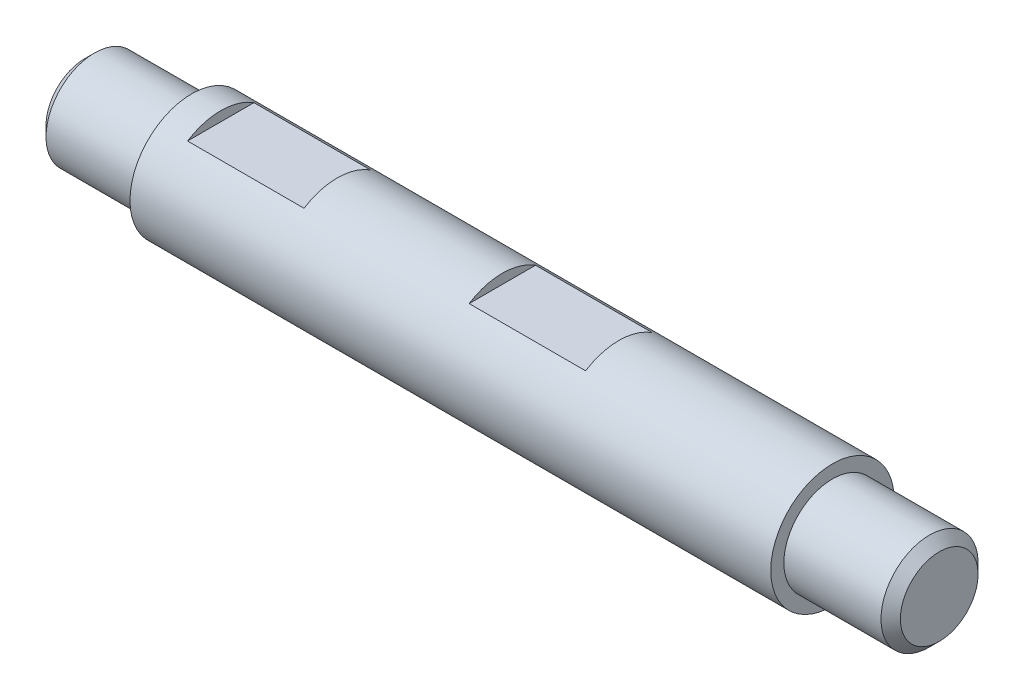
ISO-10303-21;
HEADER;
FILE_DESCRIPTION(('STEP AP214'),'2;1');
FILE_NAME('part.step','',(''),(''),'','','');
FILE_SCHEMA(('AUTOMOTIVE_DESIGN { 1 0 10303 214 1 1 1 1 }'));
ENDSEC;
DATA;
#1=APPLICATION_CONTEXT('core data for automotive mechanical design processes');
#2=APPLICATION_PROTOCOL_DEFINITION('international standard','automotive_design',2000,#1);
#3=PRODUCT_CONTEXT('',#1,'mechanical');
#4=PRODUCT('Part','Part','',(#3));
#5=PRODUCT_RELATED_PRODUCT_CATEGORY('part','',(#4));
#6=PRODUCT_DEFINITION_FORMATION('','',#4);
#7=PRODUCT_DEFINITION_CONTEXT('part definition',#1,'design');
#8=PRODUCT_DEFINITION('design','',#6,#7);
#9=PRODUCT_DEFINITION_SHAPE('','',#8);
#10=(LENGTH_UNIT() NAMED_UNIT(*) SI_UNIT(.MILLI.,.METRE.));
#11=(NAMED_UNIT(*) PLANE_ANGLE_UNIT() SI_UNIT($,.RADIAN.));
#12=(NAMED_UNIT(*) SI_UNIT($,.STERADIAN.) SOLID_ANGLE_UNIT());
#13=UNCERTAINTY_MEASURE_WITH_UNIT(LENGTH_MEASURE(1.E-05),#10,'distance_accuracy_value','');
#14=(GEOMETRIC_REPRESENTATION_CONTEXT(3) GLOBAL_UNCERTAINTY_ASSIGNED_CONTEXT((#13)) GLOBAL_UNIT_ASSIGNED_CONTEXT((#10,
#11,#12)) REPRESENTATION_CONTEXT('',''));
#15=CARTESIAN_POINT('',(0.,0.,0.));
#16=DIRECTION('',(0.,0.,1.));
#17=DIRECTION('',(1.,0.,0.));
#18=AXIS2_PLACEMENT_3D('',#15,#16,#17);
#19=CARTESIAN_POINT('',(-44.,1.20216336885193E-12,0.));
#20=DIRECTION('',(-1.,0.,0.));
#21=DIRECTION('',(0.,0.,1.));
#22=AXIS2_PLACEMENT_3D('',#19,#20,#21);
#23=CYLINDRICAL_SURFACE('',#22,6.3499999999988);
#24=CARTESIAN_POINT('',(-33.,1.20216336885193E-12,0.));
#25=DIRECTION('',(-1.,0.,0.));
#26=DIRECTION('',(0.,0.,1.));
#27=AXIS2_PLACEMENT_3D('',#24,#25,#26);
#28=CIRCLE('',#27,6.3499999999988);
#29=CARTESIAN_POINT('',(-33.,1.20216336885193E-12,6.3499999999988));
#30=VERTEX_POINT('',#29);
#31=EDGE_CURVE('E196',#30,#30,#28,.T.);
#32=ORIENTED_EDGE('',*,*,#31,.F.);
#33=EDGE_LOOP('',(#32));
#34=FACE_BOUND('',#33,.T.);
#35=CARTESIAN_POINT('',(33.,1.20216336885193E-12,0.));
#36=DIRECTION('',(-1.,0.,0.));
#37=DIRECTION('',(0.,0.,1.));
#38=AXIS2_PLACEMENT_3D('',#35,#36,#37);
#39=CIRCLE('',#38,6.3499999999988);
#40=CARTESIAN_POINT('',(33.,1.20216336885193E-12,6.3499999999988));
#41=VERTEX_POINT('',#40);
#42=EDGE_CURVE('E200',#41,#41,#39,.T.);
#43=ORIENTED_EDGE('',*,*,#42,.T.);
#44=EDGE_LOOP('',(#43));
#45=FACE_BOUND('',#44,.T.);
#46=CARTESIAN_POINT('',(-18.0007718787671,1.20216336885193E-12,0.));
#47=DIRECTION('',(-1.,0.,0.));
#48=DIRECTION('',(0.,0.,1.));
#49=AXIS2_PLACEMENT_3D('',#46,#47,#48);
#50=CIRCLE('',#49,6.3499999999988);
#51=CARTESIAN_POINT('',(-18.0007718787671,5.35072565415813,3.41939102384206));
#52=VERTEX_POINT('',#51);
#53=CARTESIAN_POINT('',(-18.0007718787671,5.35072565415813,-3.41939102384206));
#54=VERTEX_POINT('',#53);
#55=EDGE_CURVE('E220',#52,#54,#50,.T.);
#56=ORIENTED_EDGE('',*,*,#55,.F.);
#57=DIRECTION('',(-1.,0.,0.));
#58=VECTOR('',#57,1.);
#59=CARTESIAN_POINT('',(-44.,5.35072565415813,3.41939102384206));
#60=LINE('',#59,#58);
#61=CARTESIAN_POINT('',(-30.0005595450852,5.35072565415813,3.41939102384206));
#62=VERTEX_POINT('',#61);
#63=EDGE_CURVE('E230',#62,#52,#60,.F.);
#64=ORIENTED_EDGE('',*,*,#63,.F.);
#65=CARTESIAN_POINT('',(-30.0005595450852,1.20216336885193E-12,0.));
#66=DIRECTION('',(1.,0.,0.));
#67=DIRECTION('',(0.,0.,-1.));
#68=AXIS2_PLACEMENT_3D('',#65,#66,#67);
#69=CIRCLE('',#68,6.3499999999988);
#70=CARTESIAN_POINT('',(-30.0005595450852,5.35072565415813,-3.41939102384206));
#71=VERTEX_POINT('',#70);
#72=EDGE_CURVE('E227',#71,#62,#69,.T.);
#73=ORIENTED_EDGE('',*,*,#72,.F.);
#74=DIRECTION('',(-1.,0.,0.));
#75=VECTOR('',#74,1.);
#76=CARTESIAN_POINT('',(-44.,5.35072565415813,-3.41939102384206));
#77=LINE('',#76,#75);
#78=EDGE_CURVE('E223',#54,#71,#77,.T.);
#79=ORIENTED_EDGE('',*,*,#78,.F.);
#80=EDGE_LOOP('',(#56,#64,#73,#79));
#81=FACE_BOUND('',#80,.T.);
#82=DIRECTION('',(-1.,0.,0.));
#83=VECTOR('',#82,1.);
#84=CARTESIAN_POINT('',(-44.,5.35072565415813,-3.41939102384206));
#85=LINE('',#84,#83);
#86=CARTESIAN_POINT('',(11.,5.35072565415813,-3.41939102384206));
#87=VERTEX_POINT('',#86);
#88=CARTESIAN_POINT('',(-0.997849067340727,5.35072565415813,-3.41939102384206));
#89=VERTEX_POINT('',#88);
#90=EDGE_CURVE('E243',#87,#89,#85,.T.);
#91=ORIENTED_EDGE('',*,*,#90,.F.);
#92=CARTESIAN_POINT('',(11.,1.20216336885193E-12,0.));
#93=DIRECTION('',(-1.,0.,0.));
#94=DIRECTION('',(0.,0.,1.));
#95=AXIS2_PLACEMENT_3D('',#92,#93,#94);
#96=CIRCLE('',#95,6.3499999999988);
#97=CARTESIAN_POINT('',(11.,5.35072565415813,3.41939102384206));
#98=VERTEX_POINT('',#97);
#99=EDGE_CURVE('E240',#98,#87,#96,.T.);
#100=ORIENTED_EDGE('',*,*,#99,.F.);
#101=DIRECTION('',(-1.,0.,0.));
#102=VECTOR('',#101,1.);
#103=CARTESIAN_POINT('',(-44.,5.35072565415813,3.41939102384206));
#104=LINE('',#103,#102);
#105=CARTESIAN_POINT('',(-0.997849067340725,5.35072565415813,3.41939102384206));
#106=VERTEX_POINT('',#105);
#107=EDGE_CURVE('E234',#106,#98,#104,.F.);
#108=ORIENTED_EDGE('',*,*,#107,.F.);
#109=CARTESIAN_POINT('',(-0.997849067340725,1.20216336885193E-12,0.));
#110=DIRECTION('',(1.,0.,0.));
#111=DIRECTION('',(0.,0.,-1.));
#112=AXIS2_PLACEMENT_3D('',#109,#110,#111);
#113=CIRCLE('',#112,6.3499999999988);
#114=EDGE_CURVE('E237',#89,#106,#113,.T.);
#115=ORIENTED_EDGE('',*,*,#114,.F.);
#116=EDGE_LOOP('',(#91,#100,#108,#115));
#117=FACE_BOUND('',#116,.T.);
#118=CARTESIAN_POINT('',(19.5,-5.83716540796736,-2.5));
#119=CARTESIAN_POINT('',(19.5673576850007,-5.83715188959599,-2.50000987705142));
#120=CARTESIAN_POINT('',(19.6347079790208,-5.83833098696383,-2.49727802803202));
#121=CARTESIAN_POINT('',(19.7688674501521,-5.8429734405442,-2.48640804586269));
#122=CARTESIAN_POINT('',(19.8356768178386,-5.84643595336274,-2.47827190881286));
#123=CARTESIAN_POINT('',(19.9680195738622,-5.85552661269187,-2.45671260627129));
#124=CARTESIAN_POINT('',(20.0335569271791,-5.86114624652601,-2.44331021820211));
#125=CARTESIAN_POINT('',(20.1631484864145,-5.87435987170099,-2.41136754183237));
#126=CARTESIAN_POINT('',(20.2272026056221,-5.88195397815514,-2.39282695396656));
#127=CARTESIAN_POINT('',(20.4163635661514,-5.90734112890958,-2.32978393165298));
#128=CARTESIAN_POINT('',(20.5387227100794,-5.92775784038513,-2.27781828349221));
#129=CARTESIAN_POINT('',(20.7730397492828,-5.97326083591416,-2.15566278921499));
#130=CARTESIAN_POINT('',(20.8849875629146,-5.99835157683575,-2.08545552357278));
#131=CARTESIAN_POINT('',(21.1014248762376,-6.05190292367893,-1.92470433069709));
#132=CARTESIAN_POINT('',(21.2052683803083,-6.08046897864929,-1.83332395544318));
#133=CARTESIAN_POINT('',(21.3966152762427,-6.13687794555343,-1.63459099857013));
#134=CARTESIAN_POINT('',(21.4841149835944,-6.16472069321126,-1.5272348251769));
#135=CARTESIAN_POINT('',(21.6435556614343,-6.21783382131895,-1.29453105506388));
#136=CARTESIAN_POINT('',(21.7147692239529,-6.24296417063872,-1.16865048468384));
#137=CARTESIAN_POINT('',(21.8346830322677,-6.28650173497162,-0.905592572062845));
#138=CARTESIAN_POINT('',(21.8834083628005,-6.30491643618914,-0.768428018953322));
#139=CARTESIAN_POINT('',(21.9463891916658,-6.32903954460479,-0.525651304077445));
#140=CARTESIAN_POINT('',(21.9664375855943,-6.33684908173023,-0.421726993561477));
#141=CARTESIAN_POINT('',(21.9865441291003,-6.34471170374254,-0.264387820517693));
#142=CARTESIAN_POINT('',(21.9915853280877,-6.34669065705425,-0.211670260945973));
#143=CARTESIAN_POINT('',(21.998314754589,-6.34933639231694,-0.105972881903715));
#144=CARTESIAN_POINT('',(22.0000019644125,-6.35000277599851,-0.0529929877207348));
#145=CARTESIAN_POINT('',(22.,-6.3499999999976,2.38513967342727E-13));
#146=B_SPLINE_CURVE_WITH_KNOTS('',3,(#118,#119,#120,#121,#122,#123,#124,#125,#126,#127,#128,
#129,#130,#131,#132,#133,#134,#135,#136,#137,#138,#139,#140,#141,#142,#143,#144,#145),
.UNSPECIFIED.,.F.,.F.,(4,2,2,2,2,2,2,2,2,2,2,2,2,4),(0.,0.201995031654173,0.403915496915157,
0.605047179409424,0.806190590670068,1.20771363121217,1.60962151772068,2.03147818559964,
2.45342984150153,2.89160203128091,3.32928426888792,3.64668681783267,3.80556090071011,
3.96448318289366),.UNSPECIFIED.);
#147=CARTESIAN_POINT('',(19.5,-5.83716540796736,-2.5));
#148=VERTEX_POINT('',#147);
#149=CARTESIAN_POINT('',(22.,-6.3499999999988,0.));
#150=VERTEX_POINT('',#149);
#151=EDGE_CURVE('E11',#148,#150,#146,.T.);
#152=ORIENTED_EDGE('',*,*,#151,.F.);
#153=DIRECTION('',(-1.,0.,0.));
#154=VECTOR('',#153,1.);
#155=CARTESIAN_POINT('',(-44.,-5.83716540796736,-2.5));
#156=LINE('',#155,#154);
#157=CARTESIAN_POINT('',(-7.50066567913226,-5.83716540796736,-2.5));
#158=VERTEX_POINT('',#157);
#159=EDGE_CURVE('E60',#158,#148,#156,.F.);
#160=ORIENTED_EDGE('',*,*,#159,.F.);
#161=CARTESIAN_POINT('',(-10.0006656791323,-6.3499999999976,0.));
#162=CARTESIAN_POINT('',(-10.0006750807826,-6.35000995560584,-0.0675627899307112));
#163=CARTESIAN_POINT('',(-9.99792705919755,-6.34892196242804,-0.135119379229892));
#164=CARTESIAN_POINT('',(-9.98698918968387,-6.34462436529726,-0.26970360119509));
#165=CARTESIAN_POINT('',(-9.97880091911467,-6.34141537631251,-0.336731381486926));
#166=CARTESIAN_POINT('',(-9.95709279749447,-6.33296451665363,-0.469552925296904));
#167=CARTESIAN_POINT('',(-9.94359133511949,-6.32772965843207,-0.535350133638862));
#168=CARTESIAN_POINT('',(-9.91140264353984,-6.31537284185626,-0.665465908835843));
#169=CARTESIAN_POINT('',(-9.89271521374624,-6.3082508105082,-0.729784418391795));
#170=CARTESIAN_POINT('',(-9.82914042182396,-6.28432392581927,-0.91977854672048));
#171=CARTESIAN_POINT('',(-9.77670621052069,-6.26494425783297,-1.04270001292063));
#172=CARTESIAN_POINT('',(-9.65345229246331,-6.22122849043737,-1.27796588033146));
#173=CARTESIAN_POINT('',(-9.58261919054256,-6.19688878270375,-1.39030249378276));
#174=CARTESIAN_POINT('',(-9.42119028414824,-6.14449776483182,-1.60639532021251));
#175=CARTESIAN_POINT('',(-9.32989927336587,-6.11633470278855,-1.70960577454521));
#176=CARTESIAN_POINT('',(-9.13161449988694,-6.05998914124497,-1.89970685606194));
#177=CARTESIAN_POINT('',(-9.02461413115282,-6.03180663855627,-1.98659058237836));
#178=CARTESIAN_POINT('',(-8.79233048627886,-5.97725896200972,-2.14528029924533));
#179=CARTESIAN_POINT('',(-8.66645617074501,-5.95102531919995,-2.21627051782301));
#180=CARTESIAN_POINT('',(-8.40344552392075,-5.90515378724462,-2.33576384990019));
#181=CARTESIAN_POINT('',(-8.26632460284836,-5.88550705452696,-2.38429714758587));
#182=CARTESIAN_POINT('',(-8.02404521736193,-5.85971004699095,-2.44685249478069));
#183=CARTESIAN_POINT('',(-7.92061239938269,-5.85132532673137,-2.46672018922142));
#184=CARTESIAN_POINT('',(-7.76397623751537,-5.84286758092647,-2.48665366149441));
#185=CARTESIAN_POINT('',(-7.71147679047582,-5.8407348383483,-2.49165351199236));
#186=CARTESIAN_POINT('',(-7.60621130323489,-5.83788158573845,-2.49832829333527));
#187=CARTESIAN_POINT('',(-7.55344517964735,-5.8371615488559,-2.50000211021396));
#188=CARTESIAN_POINT('',(-7.50066567913226,-5.83716540796736,-2.5));
#189=B_SPLINE_CURVE_WITH_KNOTS('',3,(#161,#162,#163,#164,#165,#166,#167,#168,#169,#170,#171,
#172,#173,#174,#175,#176,#177,#178,#179,#180,#181,#182,#183,#184,#185,#186,#187,#188),
.UNSPECIFIED.,.F.,.F.,(4,2,2,2,2,2,2,2,2,2,2,2,2,4),(0.,0.202613304055982,0.405167887524172,
0.607027520013086,0.808894961354591,1.21200617335277,1.61541169390207,2.03547281746443,
2.45571109213199,2.89414584370637,3.33198957412198,3.64797487278224,3.80620288063314,
3.96448387381014),.UNSPECIFIED.);
#190=CARTESIAN_POINT('',(-10.0006656791323,-6.35,0.));
#191=VERTEX_POINT('',#190);
#192=EDGE_CURVE('E286',#191,#158,#189,.T.);
#193=ORIENTED_EDGE('',*,*,#192,.F.);
#194=DIRECTION('',(0.,0.,1.));
#195=VECTOR('',#194,1.);
#196=CARTESIAN_POINT('',(-10.0006656791323,-6.35,0.));
#197=LINE('',#196,#195);
#198=CARTESIAN_POINT('',(-10.0006656791323,-6.35,0.00644608822753191));
#199=VERTEX_POINT('',#198);
#200=EDGE_CURVE('E369',#191,#199,#197,.T.);
#201=ORIENTED_EDGE('',*,*,#200,.T.);
#202=CARTESIAN_POINT('',(-7.51066567913226,-5.83868623309594,2.49644608822755));
#203=CARTESIAN_POINT('',(-7.57775991812295,-5.83867282029788,2.4964559160146));
#204=CARTESIAN_POINT('',(-7.64484681591394,-5.83984540512509,2.49373451954645));
#205=CARTESIAN_POINT('',(-7.77848186690892,-5.84446238786723,2.48290605515361));
#206=CARTESIAN_POINT('',(-7.84503020915186,-5.84790595021789,2.47480096805062));
#207=CARTESIAN_POINT('',(-7.97685689390368,-5.85694719752136,2.45332371083373));
#208=CARTESIAN_POINT('',(-8.04213917389343,-5.8625364386519,2.43997218208031));
#209=CARTESIAN_POINT('',(-8.1712265717766,-5.87567920457162,2.40815049766328));
#210=CARTESIAN_POINT('',(-8.23503160380729,-5.88323284322778,2.38968004527548));
#211=CARTESIAN_POINT('',(-8.42345793548545,-5.90848622880192,2.32687482502046));
#212=CARTESIAN_POINT('',(-8.54534236347899,-5.92879711456778,2.27510453504876));
#213=CARTESIAN_POINT('',(-8.77874792882148,-5.97407138249781,2.15340779955342));
#214=CARTESIAN_POINT('',(-8.89025906952737,-5.99903918428155,2.0834640816488));
#215=CARTESIAN_POINT('',(-9.10582943003935,-6.05233452495038,1.92333103056341));
#216=CARTESIAN_POINT('',(-9.20924720831309,-6.08076716179658,1.83231139375353));
#217=CARTESIAN_POINT('',(-9.3998058005631,-6.13693011426983,1.63436904508062));
#218=CARTESIAN_POINT('',(-9.48694291971647,-6.16466026924044,1.52744273313449));
#219=CARTESIAN_POINT('',(-9.64572356403821,-6.21758677774058,1.29567202848421));
#220=CARTESIAN_POINT('',(-9.71664154984544,-6.24264450275782,1.17029633485331));
#221=CARTESIAN_POINT('',(-9.83605511084898,-6.28610014825748,0.908298769098331));
#222=CARTESIAN_POINT('',(-9.88457559327127,-6.30450546161004,0.771689589437142));
#223=CARTESIAN_POINT('',(-9.9472869665491,-6.32867766908918,0.529908705825144));
#224=CARTESIAN_POINT('',(-9.96724836228389,-6.33652797280705,0.426418359780825));
#225=CARTESIAN_POINT('',(-9.9872678384861,-6.34448483075672,0.269734879205412));
#226=CARTESIAN_POINT('',(-9.99228725314517,-6.34650073891525,0.217237105438723));
#227=CARTESIAN_POINT('',(-9.9989876565521,-6.34923147630899,0.111979424887014));
#228=CARTESIAN_POINT('',(-10.0006676326809,-6.34994591089243,0.0592194434530562));
#229=CARTESIAN_POINT('',(-10.0006656791323,-6.34999672851345,0.00644576124289846));
#230=B_SPLINE_CURVE_WITH_KNOTS('',3,(#202,#203,#204,#205,#206,#207,#208,#209,#210,#211,#212,
#213,#214,#215,#216,#217,#218,#219,#220,#221,#222,#223,#224,#225,#226,#227,#228,#229),
.UNSPECIFIED.,.F.,.F.,(4,2,2,2,2,2,2,2,2,2,2,2,2,4),(0.,0.201205055614175,0.402336122812474,
0.602683667163188,0.803042827315907,1.20300281138827,1.60334432462756,2.02348847831671,
2.44372786633549,2.8801441426787,3.3160739245416,3.63216697965316,3.79038375605576,
3.94864850127048),.UNSPECIFIED.);
#231=CARTESIAN_POINT('',(-7.51066567913226,-5.83868623309594,2.49644608822755));
#232=VERTEX_POINT('',#231);
#233=EDGE_CURVE('E279',#232,#199,#230,.T.);
#234=ORIENTED_EDGE('',*,*,#233,.F.);
#235=DIRECTION('',(-1.,0.,0.));
#236=VECTOR('',#235,1.);
#237=CARTESIAN_POINT('',(-44.,-5.83868623309594,2.49644608822755));
#238=LINE('',#237,#236);
#239=CARTESIAN_POINT('',(19.51,-5.83868623309594,2.49644608822755));
#240=VERTEX_POINT('',#239);
#241=EDGE_CURVE('E254',#240,#232,#238,.T.);
#242=ORIENTED_EDGE('',*,*,#241,.F.);
#243=CARTESIAN_POINT('',(22.,-6.34999672818152,0.00644608822753166));
#244=CARTESIAN_POINT('',(22.0000093467527,-6.34993827250171,0.0737749245421758));
#245=CARTESIAN_POINT('',(21.9972693910513,-6.34878945442219,0.141096448565991));
#246=CARTESIAN_POINT('',(21.9863640261319,-6.34438543291972,0.2752102878835));
#247=CARTESIAN_POINT('',(21.9782001893913,-6.34113084000467,0.342002750883515));
#248=CARTESIAN_POINT('',(21.9565572096212,-6.33260409489306,0.474356761651975));
#249=CARTESIAN_POINT('',(21.9430963408862,-6.32733888099077,0.539921737985374));
#250=CARTESIAN_POINT('',(21.9110048129762,-6.31493599519724,0.669576486718976));
#251=CARTESIAN_POINT('',(21.8923739531521,-6.30779825063304,0.733666201759223));
#252=CARTESIAN_POINT('',(21.8289921015844,-6.28384522396076,0.922981968241252));
#253=CARTESIAN_POINT('',(21.7767175936967,-6.26447601165417,1.04546115861246));
#254=CARTESIAN_POINT('',(21.6538391754884,-6.22082814968606,1.27987324434243));
#255=CARTESIAN_POINT('',(21.5832219424359,-6.19654593444614,1.39179839319006));
#256=CARTESIAN_POINT('',(21.422292704436,-6.14431141391331,1.60707796252401));
#257=CARTESIAN_POINT('',(21.3312893928911,-6.11624914853159,1.70988960263596));
#258=CARTESIAN_POINT('',(21.1336304449178,-6.06012879490439,1.89924051381329));
#259=CARTESIAN_POINT('',(21.0269682756856,-6.03207071331881,1.98577295872928));
#260=CARTESIAN_POINT('',(20.7954812367229,-5.97779988442698,2.14375749921867));
#261=CARTESIAN_POINT('',(20.6700742628319,-5.95171757583202,2.21440532198783));
#262=CARTESIAN_POINT('',(20.4080448364994,-5.90612204913792,2.33330172277595));
#263=CARTESIAN_POINT('',(20.2714377191185,-5.8866000296452,2.38158034491516));
#264=CARTESIAN_POINT('',(20.0303032291952,-5.86102388530558,2.44371021775868));
#265=CARTESIAN_POINT('',(19.92748939102,-5.85273008590622,2.46341372926605));
#266=CARTESIAN_POINT('',(19.7198150047579,-5.8415232404866,2.48981136381032));
#267=CARTESIAN_POINT('',(19.6149524336064,-5.83861581618059,2.49649189525207));
#268=CARTESIAN_POINT('',(19.51,-5.83868623309594,2.49644608822755));
#269=B_SPLINE_CURVE_WITH_KNOTS('',3,(#243,#244,#245,#246,#247,#248,#249,#250,#251,#252,#253,
#254,#255,#256,#257,#258,#259,#260,#261,#262,#263,#264,#265,#266,#267,#268),.UNSPECIFIED.,.F.,
.F.,(4,2,2,2,2,2,2,2,2,2,2,2,4),(0.,0.201911742424921,0.40376497265405,0.604927847565855,
0.806098530768677,1.20781838135309,1.60983082993634,2.02839896388786,2.44714222142781,
2.88381365363986,3.31989687917654,3.6340157048079,3.94846218931434),.UNSPECIFIED.);
#270=CARTESIAN_POINT('',(22.,-6.35,0.00644608822753185));
#271=VERTEX_POINT('',#270);
#272=EDGE_CURVE('E246',#271,#240,#269,.T.);
#273=ORIENTED_EDGE('',*,*,#272,.F.);
#274=DIRECTION('',(0.,0.,-1.));
#275=VECTOR('',#274,1.);
#276=CARTESIAN_POINT('',(22.,-6.35,0.));
#277=LINE('',#276,#275);
#278=EDGE_CURVE('E161',#271,#150,#277,.T.);
#279=ORIENTED_EDGE('',*,*,#278,.T.);
#280=EDGE_LOOP('',(#152,#160,#193,#201,#234,#242,#273,#279));
#281=FACE_BOUND('',#280,.T.);
#282=ADVANCED_FACE('F44',(#34,#45,#81,#117,#281),#23,.T.);
#283=CARTESIAN_POINT('',(33.,6.35,0.));
#284=DIRECTION('',(-1.,0.,0.));
#285=DIRECTION('',(0.,0.,1.));
#286=AXIS2_PLACEMENT_3D('',#283,#284,#285);
#287=PLANE('',#286);
#288=ORIENTED_EDGE('',*,*,#42,.F.);
#289=EDGE_LOOP('',(#288));
#290=FACE_BOUND('',#289,.T.);
#291=CARTESIAN_POINT('',(33.,1.20216336885193E-12,0.));
#292=DIRECTION('',(-1.,0.,0.));
#293=DIRECTION('',(0.,0.,1.));
#294=AXIS2_PLACEMENT_3D('',#291,#292,#293);
#295=CIRCLE('',#294,5.);
#296=CARTESIAN_POINT('',(33.,1.20216336885193E-12,5.));
#297=VERTEX_POINT('',#296);
#298=EDGE_CURVE('E184',#297,#297,#295,.T.);
#299=ORIENTED_EDGE('',*,*,#298,.T.);
#300=EDGE_LOOP('',(#299));
#301=FACE_BOUND('',#300,.T.);
#302=ADVANCED_FACE('F341',(#290,#301),#287,.F.);
#303=CARTESIAN_POINT('',(-33.,6.35,0.));
#304=DIRECTION('',(1.,0.,0.));
#305=DIRECTION('',(0.,0.,-1.));
#306=AXIS2_PLACEMENT_3D('',#303,#304,#305);
#307=PLANE('',#306);
#308=CARTESIAN_POINT('',(-33.,1.20216336885193E-12,0.));
#309=DIRECTION('',(-1.,0.,0.));
#310=DIRECTION('',(0.,0.,1.));
#311=AXIS2_PLACEMENT_3D('',#308,#309,#310);
#312=CIRCLE('',#311,5.);
#313=CARTESIAN_POINT('',(-33.,1.20216336885193E-12,5.));
#314=VERTEX_POINT('',#313);
#315=EDGE_CURVE('E192',#314,#314,#312,.T.);
#316=ORIENTED_EDGE('',*,*,#315,.F.);
#317=EDGE_LOOP('',(#316));
#318=FACE_BOUND('',#317,.T.);
#319=ORIENTED_EDGE('',*,*,#31,.T.);
#320=EDGE_LOOP('',(#319));
#321=FACE_BOUND('',#320,.T.);
#322=ADVANCED_FACE('F338',(#318,#321),#307,.F.);
#323=CARTESIAN_POINT('',(-44.,1.20216336885193E-12,0.));
#324=DIRECTION('',(-1.,0.,0.));
#325=DIRECTION('',(0.,0.,1.));
#326=AXIS2_PLACEMENT_3D('',#323,#324,#325);
#327=CYLINDRICAL_SURFACE('',#326,5.);
#328=CARTESIAN_POINT('',(-43.,1.20216336885193E-12,0.));
#329=DIRECTION('',(1.,0.,0.));
#330=DIRECTION('',(0.,0.,-1.));
#331=AXIS2_PLACEMENT_3D('',#328,#329,#330);
#332=CIRCLE('',#331,5.);
#333=CARTESIAN_POINT('',(-43.,1.20216336885193E-12,-5.));
#334=VERTEX_POINT('',#333);
#335=EDGE_CURVE('E208',#334,#334,#332,.T.);
#336=ORIENTED_EDGE('',*,*,#335,.T.);
#337=EDGE_LOOP('',(#336));
#338=FACE_BOUND('',#337,.T.);
#339=ORIENTED_EDGE('',*,*,#315,.T.);
#340=EDGE_LOOP('',(#339));
#341=FACE_BOUND('',#340,.T.);
#342=ADVANCED_FACE('F335',(#338,#341),#327,.T.);
#343=CARTESIAN_POINT('',(-44.,5.0000000000012,0.));
#344=DIRECTION('',(1.,0.,0.));
#345=DIRECTION('',(0.,0.,-1.));
#346=AXIS2_PLACEMENT_3D('',#343,#344,#345);
#347=PLANE('',#346);
#348=CARTESIAN_POINT('',(-44.,1.20216336885193E-12,0.));
#349=DIRECTION('',(1.,0.,0.));
#350=DIRECTION('',(0.,0.,-1.));
#351=AXIS2_PLACEMENT_3D('',#348,#349,#350);
#352=CIRCLE('',#351,4.);
#353=CARTESIAN_POINT('',(-44.,1.20216336885193E-12,-4.));
#354=VERTEX_POINT('',#353);
#355=EDGE_CURVE('E204',#354,#354,#352,.F.);
#356=ORIENTED_EDGE('',*,*,#355,.T.);
#357=EDGE_LOOP('',(#356));
#358=FACE_BOUND('',#357,.T.);
#359=ADVANCED_FACE('F331',(#358),#347,.F.);
#360=CARTESIAN_POINT('',(44.,5.0000000000012,0.));
#361=DIRECTION('',(-1.,0.,0.));
#362=DIRECTION('',(0.,0.,1.));
#363=AXIS2_PLACEMENT_3D('',#360,#361,#362);
#364=PLANE('',#363);
#365=CARTESIAN_POINT('',(44.,1.20216336885193E-12,0.));
#366=DIRECTION('',(-1.,0.,0.));
#367=DIRECTION('',(0.,0.,1.));
#368=AXIS2_PLACEMENT_3D('',#365,#366,#367);
#369=CIRCLE('',#368,4.00000000000001);
#370=CARTESIAN_POINT('',(44.,1.20216336885193E-12,4.00000000000001));
#371=VERTEX_POINT('',#370);
#372=EDGE_CURVE('E216',#371,#371,#369,.F.);
#373=ORIENTED_EDGE('',*,*,#372,.T.);
#374=EDGE_LOOP('',(#373));
#375=FACE_BOUND('',#374,.T.);
#376=ADVANCED_FACE('F327',(#375),#364,.F.);
#377=CARTESIAN_POINT('',(-44.,1.20216336885193E-12,0.));
#378=DIRECTION('',(-1.,0.,0.));
#379=DIRECTION('',(0.,0.,1.));
#380=AXIS2_PLACEMENT_3D('',#377,#378,#379);
#381=CYLINDRICAL_SURFACE('',#380,5.);
#382=CARTESIAN_POINT('',(43.,1.20216336885193E-12,0.));
#383=DIRECTION('',(-1.,0.,0.));
#384=DIRECTION('',(0.,0.,1.));
#385=AXIS2_PLACEMENT_3D('',#382,#383,#384);
#386=CIRCLE('',#385,5.);
#387=CARTESIAN_POINT('',(43.,1.20216336885193E-12,5.));
#388=VERTEX_POINT('',#387);
#389=EDGE_CURVE('E212',#388,#388,#386,.T.);
#390=ORIENTED_EDGE('',*,*,#389,.T.);
#391=EDGE_LOOP('',(#390));
#392=FACE_BOUND('',#391,.T.);
#393=ORIENTED_EDGE('',*,*,#298,.F.);
#394=EDGE_LOOP('',(#393));
#395=FACE_BOUND('',#394,.T.);
#396=ADVANCED_FACE('F323',(#392,#395),#381,.T.);
#397=CARTESIAN_POINT('',(-44.,1.20216336885193E-12,0.));
#398=DIRECTION('',(1.,0.,0.));
#399=DIRECTION('',(0.,0.,-1.));
#400=AXIS2_PLACEMENT_3D('',#397,#398,#399);
#401=CONICAL_SURFACE('',#400,4.,0.785398163397447);
#402=ORIENTED_EDGE('',*,*,#335,.F.);
#403=EDGE_LOOP('',(#402));
#404=FACE_BOUND('',#403,.T.);
#405=ORIENTED_EDGE('',*,*,#355,.F.);
#406=EDGE_LOOP('',(#405));
#407=FACE_BOUND('',#406,.T.);
#408=ADVANCED_FACE('F326',(#404,#407),#401,.T.);
#409=CARTESIAN_POINT('',(43.,1.20216336885193E-12,0.));
#410=DIRECTION('',(-1.,0.,0.));
#411=DIRECTION('',(0.,0.,1.));
#412=AXIS2_PLACEMENT_3D('',#409,#410,#411);
#413=CONICAL_SURFACE('',#412,5.,0.785398163397457);
#414=ORIENTED_EDGE('',*,*,#372,.F.);
#415=EDGE_LOOP('',(#414));
#416=FACE_BOUND('',#415,.T.);
#417=ORIENTED_EDGE('',*,*,#389,.F.);
#418=EDGE_LOOP('',(#417));
#419=FACE_BOUND('',#418,.T.);
#420=ADVANCED_FACE('F47',(#416,#419),#413,.T.);
#421=CARTESIAN_POINT('',(-30.0005595450852,6.35,6.3499999999988));
#422=DIRECTION('',(1.,0.,0.));
#423=DIRECTION('',(0.,0.,-1.));
#424=AXIS2_PLACEMENT_3D('',#421,#422,#423);
#425=PLANE('',#424);
#426=DIRECTION('',(0.,0.,-1.));
#427=VECTOR('',#426,1.);
#428=CARTESIAN_POINT('',(-30.0005595450852,5.35072565415813,6.3499999999988));
#429=LINE('',#428,#427);
#430=EDGE_CURVE('E166',#62,#71,#429,.T.);
#431=ORIENTED_EDGE('',*,*,#430,.T.);
#432=ORIENTED_EDGE('',*,*,#72,.T.);
#433=EDGE_LOOP('',(#431,#432));
#434=FACE_BOUND('',#433,.T.);
#435=ADVANCED_FACE('F312',(#434),#425,.T.);
#436=CARTESIAN_POINT('',(-18.0007718787671,5.35072565415813,6.3499999999988));
#437=DIRECTION('',(0.,1.,0.));
#438=DIRECTION('',(0.,0.,1.));
#439=AXIS2_PLACEMENT_3D('',#436,#437,#438);
#440=PLANE('',#439);
#441=ORIENTED_EDGE('',*,*,#78,.T.);
#442=ORIENTED_EDGE('',*,*,#430,.F.);
#443=ORIENTED_EDGE('',*,*,#63,.T.);
#444=DIRECTION('',(0.,0.,-1.));
#445=VECTOR('',#444,1.);
#446=CARTESIAN_POINT('',(-18.0007718787671,5.35072565415813,6.3499999999988));
#447=LINE('',#446,#445);
#448=EDGE_CURVE('E173',#52,#54,#447,.T.);
#449=ORIENTED_EDGE('',*,*,#448,.T.);
#450=EDGE_LOOP('',(#441,#442,#443,#449));
#451=FACE_BOUND('',#450,.T.);
#452=ADVANCED_FACE('F315',(#451),#440,.T.);
#453=CARTESIAN_POINT('',(-18.0007718787671,6.35,6.3499999999988));
#454=DIRECTION('',(-1.,0.,0.));
#455=DIRECTION('',(0.,0.,1.));
#456=AXIS2_PLACEMENT_3D('',#453,#454,#455);
#457=PLANE('',#456);
#458=ORIENTED_EDGE('',*,*,#448,.F.);
#459=ORIENTED_EDGE('',*,*,#55,.T.);
#460=EDGE_LOOP('',(#458,#459));
#461=FACE_BOUND('',#460,.T.);
#462=ADVANCED_FACE('F310',(#461),#457,.T.);
#463=CARTESIAN_POINT('',(11.,6.35,6.3499999999988));
#464=DIRECTION('',(-1.,0.,0.));
#465=DIRECTION('',(0.,0.,1.));
#466=AXIS2_PLACEMENT_3D('',#463,#464,#465);
#467=PLANE('',#466);
#468=ORIENTED_EDGE('',*,*,#99,.T.);
#469=DIRECTION('',(0.,0.,-1.));
#470=VECTOR('',#469,1.);
#471=CARTESIAN_POINT('',(11.,5.35072565415813,6.3499999999988));
#472=LINE('',#471,#470);
#473=EDGE_CURVE('E179',#98,#87,#472,.T.);
#474=ORIENTED_EDGE('',*,*,#473,.F.);
#475=EDGE_LOOP('',(#468,#474));
#476=FACE_BOUND('',#475,.T.);
#477=ADVANCED_FACE('F306',(#476),#467,.T.);
#478=CARTESIAN_POINT('',(-0.997849067340727,6.35,6.3499999999988));
#479=DIRECTION('',(1.,0.,0.));
#480=DIRECTION('',(0.,0.,-1.));
#481=AXIS2_PLACEMENT_3D('',#478,#479,#480);
#482=PLANE('',#481);
#483=DIRECTION('',(0.,0.,-1.));
#484=VECTOR('',#483,1.);
#485=CARTESIAN_POINT('',(-0.997849067340727,5.35072565415813,6.3499999999988));
#486=LINE('',#485,#484);
#487=EDGE_CURVE('E74',#106,#89,#486,.T.);
#488=ORIENTED_EDGE('',*,*,#487,.T.);
#489=ORIENTED_EDGE('',*,*,#114,.T.);
#490=EDGE_LOOP('',(#488,#489));
#491=FACE_BOUND('',#490,.T.);
#492=ADVANCED_FACE('F303',(#491),#482,.T.);
#493=CARTESIAN_POINT('',(11.,5.35072565415813,6.3499999999988));
#494=DIRECTION('',(0.,1.,0.));
#495=DIRECTION('',(0.,0.,1.));
#496=AXIS2_PLACEMENT_3D('',#493,#494,#495);
#497=PLANE('',#496);
#498=ORIENTED_EDGE('',*,*,#90,.T.);
#499=ORIENTED_EDGE('',*,*,#487,.F.);
#500=ORIENTED_EDGE('',*,*,#107,.T.);
#501=ORIENTED_EDGE('',*,*,#473,.T.);
#502=EDGE_LOOP('',(#498,#499,#500,#501));
#503=FACE_BOUND('',#502,.T.);
#504=ADVANCED_FACE('F300',(#503),#497,.T.);
#505=CARTESIAN_POINT('',(19.5,-3.35,0.));
#506=DIRECTION('',(0.,-1.,0.));
#507=DIRECTION('',(0.,0.,-1.));
#508=AXIS2_PLACEMENT_3D('',#505,#506,#507);
#509=CYLINDRICAL_SURFACE('',#508,2.5);
#510=ORIENTED_EDGE('',*,*,#151,.T.);
#511=DIRECTION('',(0.,-1.,0.));
#512=VECTOR('',#511,1.);
#513=CARTESIAN_POINT('',(22.,-3.35,0.));
#514=LINE('',#513,#512);
#515=CARTESIAN_POINT('',(22.,-3.35,0.));
#516=VERTEX_POINT('',#515);
#517=EDGE_CURVE('E67',#516,#150,#514,.T.);
#518=ORIENTED_EDGE('',*,*,#517,.F.);
#519=CARTESIAN_POINT('',(19.5,-3.35,0.));
#520=DIRECTION('',(0.,1.,0.));
#521=DIRECTION('',(0.,0.,1.));
#522=AXIS2_PLACEMENT_3D('',#519,#520,#521);
#523=CIRCLE('',#522,2.5);
#524=CARTESIAN_POINT('',(19.5,-3.35,-2.5));
#525=VERTEX_POINT('',#524);
#526=EDGE_CURVE('E146',#516,#525,#523,.T.);
#527=ORIENTED_EDGE('',*,*,#526,.T.);
#528=DIRECTION('',(0.,-1.,0.));
#529=VECTOR('',#528,1.);
#530=CARTESIAN_POINT('',(19.5,-3.35,-2.5));
#531=LINE('',#530,#529);
#532=EDGE_CURVE('E158',#525,#148,#531,.T.);
#533=ORIENTED_EDGE('',*,*,#532,.T.);
#534=EDGE_LOOP('',(#510,#518,#527,#533));
#535=FACE_BOUND('',#534,.T.);
#536=ADVANCED_FACE('F157',(#535),#509,.F.);
#537=CARTESIAN_POINT('',(19.5,-3.35,-2.5));
#538=DIRECTION('',(0.,0.,1.));
#539=DIRECTION('',(1.,0.,0.));
#540=AXIS2_PLACEMENT_3D('',#537,#538,#539);
#541=PLANE('',#540);
#542=ORIENTED_EDGE('',*,*,#159,.T.);
#543=ORIENTED_EDGE('',*,*,#532,.F.);
#544=DIRECTION('',(-1.,0.,0.));
#545=VECTOR('',#544,1.);
#546=CARTESIAN_POINT('',(19.5,-3.35,-2.5));
#547=LINE('',#546,#545);
#548=CARTESIAN_POINT('',(-7.50066567913226,-3.35,-2.5));
#549=VERTEX_POINT('',#548);
#550=EDGE_CURVE('E142',#525,#549,#547,.T.);
#551=ORIENTED_EDGE('',*,*,#550,.T.);
#552=DIRECTION('',(0.,-1.,0.));
#553=VECTOR('',#552,1.);
#554=CARTESIAN_POINT('',(-7.50066567913226,-3.35,-2.5));
#555=LINE('',#554,#553);
#556=EDGE_CURVE('E167',#549,#158,#555,.T.);
#557=ORIENTED_EDGE('',*,*,#556,.T.);
#558=EDGE_LOOP('',(#542,#543,#551,#557));
#559=FACE_BOUND('',#558,.T.);
#560=ADVANCED_FACE('F163',(#559),#541,.T.);
#561=CARTESIAN_POINT('',(-7.50066567913228,-3.35,0.));
#562=DIRECTION('',(0.,-1.,0.));
#563=DIRECTION('',(0.,0.,-1.));
#564=AXIS2_PLACEMENT_3D('',#561,#562,#563);
#565=CYLINDRICAL_SURFACE('',#564,2.5);
#566=ORIENTED_EDGE('',*,*,#192,.T.);
#567=ORIENTED_EDGE('',*,*,#556,.F.);
#568=CARTESIAN_POINT('',(-7.50066567913228,-3.35,0.));
#569=DIRECTION('',(0.,1.,0.));
#570=DIRECTION('',(0.,0.,1.));
#571=AXIS2_PLACEMENT_3D('',#568,#569,#570);
#572=CIRCLE('',#571,2.5);
#573=CARTESIAN_POINT('',(-10.0006656791323,-3.35,0.));
#574=VERTEX_POINT('',#573);
#575=EDGE_CURVE('E148',#549,#574,#572,.T.);
#576=ORIENTED_EDGE('',*,*,#575,.T.);
#577=DIRECTION('',(0.,-1.,0.));
#578=VECTOR('',#577,1.);
#579=CARTESIAN_POINT('',(-10.0006656791323,-3.35,0.));
#580=LINE('',#579,#578);
#581=EDGE_CURVE('E175',#574,#191,#580,.T.);
#582=ORIENTED_EDGE('',*,*,#581,.T.);
#583=EDGE_LOOP('',(#566,#567,#576,#582));
#584=FACE_BOUND('',#583,.T.);
#585=ADVANCED_FACE('F276',(#584),#565,.F.);
#586=CARTESIAN_POINT('',(-7.51066567913228,-3.35,0.00644608822755006));
#587=DIRECTION('',(0.,-1.,0.));
#588=DIRECTION('',(0.,0.,-1.));
#589=AXIS2_PLACEMENT_3D('',#586,#587,#588);
#590=CYLINDRICAL_SURFACE('',#589,2.49);
#591=ORIENTED_EDGE('',*,*,#233,.T.);
#592=DIRECTION('',(0.,-1.,0.));
#593=VECTOR('',#592,1.);
#594=CARTESIAN_POINT('',(-10.0006656791323,-3.35,0.00644608822753191));
#595=LINE('',#594,#593);
#596=CARTESIAN_POINT('',(-10.0006656791323,-3.35,0.00644608822753191));
#597=VERTEX_POINT('',#596);
#598=EDGE_CURVE('E391',#597,#199,#595,.T.);
#599=ORIENTED_EDGE('',*,*,#598,.F.);
#600=CARTESIAN_POINT('',(-7.51066567913228,-3.35,0.00644608822755006));
#601=DIRECTION('',(0.,1.,0.));
#602=DIRECTION('',(0.,0.,1.));
#603=AXIS2_PLACEMENT_3D('',#600,#601,#602);
#604=CIRCLE('',#603,2.49);
#605=CARTESIAN_POINT('',(-7.51066567913226,-3.35,2.49644608822755));
#606=VERTEX_POINT('',#605);
#607=EDGE_CURVE('E403',#597,#606,#604,.T.);
#608=ORIENTED_EDGE('',*,*,#607,.T.);
#609=DIRECTION('',(0.,-1.,0.));
#610=VECTOR('',#609,1.);
#611=CARTESIAN_POINT('',(-7.51066567913226,-3.35,2.49644608822755));
#612=LINE('',#611,#610);
#613=EDGE_CURVE('E387',#606,#232,#612,.T.);
#614=ORIENTED_EDGE('',*,*,#613,.T.);
#615=EDGE_LOOP('',(#591,#599,#608,#614));
#616=FACE_BOUND('',#615,.T.);
#617=ADVANCED_FACE('F271',(#616),#590,.F.);
#618=CARTESIAN_POINT('',(19.51,-3.35,2.49644608822755));
#619=DIRECTION('',(0.,0.,-1.));
#620=DIRECTION('',(-1.,0.,0.));
#621=AXIS2_PLACEMENT_3D('',#618,#619,#620);
#622=PLANE('',#621);
#623=ORIENTED_EDGE('',*,*,#241,.T.);
#624=ORIENTED_EDGE('',*,*,#613,.F.);
#625=DIRECTION('',(1.,0.,0.));
#626=VECTOR('',#625,1.);
#627=CARTESIAN_POINT('',(19.51,-3.35,2.49644608822755));
#628=LINE('',#627,#626);
#629=CARTESIAN_POINT('',(19.51,-3.35,2.49644608822755));
#630=VERTEX_POINT('',#629);
#631=EDGE_CURVE('E405',#606,#630,#628,.T.);
#632=ORIENTED_EDGE('',*,*,#631,.T.);
#633=DIRECTION('',(0.,-1.,0.));
#634=VECTOR('',#633,1.);
#635=CARTESIAN_POINT('',(19.51,-3.35,2.49644608822755));
#636=LINE('',#635,#634);
#637=EDGE_CURVE('E383',#630,#240,#636,.T.);
#638=ORIENTED_EDGE('',*,*,#637,.T.);
#639=EDGE_LOOP('',(#623,#624,#632,#638));
#640=FACE_BOUND('',#639,.T.);
#641=ADVANCED_FACE('F265',(#640),#622,.T.);
#642=CARTESIAN_POINT('',(19.51,-3.35,0.00644608822755006));
#643=DIRECTION('',(0.,-1.,0.));
#644=DIRECTION('',(0.,0.,-1.));
#645=AXIS2_PLACEMENT_3D('',#642,#643,#644);
#646=CYLINDRICAL_SURFACE('',#645,2.49);
#647=ORIENTED_EDGE('',*,*,#272,.T.);
#648=ORIENTED_EDGE('',*,*,#637,.F.);
#649=CARTESIAN_POINT('',(19.51,-3.35,0.00644608822755006));
#650=DIRECTION('',(0.,1.,0.));
#651=DIRECTION('',(0.,0.,1.));
#652=AXIS2_PLACEMENT_3D('',#649,#650,#651);
#653=CIRCLE('',#652,2.49);
#654=CARTESIAN_POINT('',(22.,-3.35,0.00644608822753185));
#655=VERTEX_POINT('',#654);
#656=EDGE_CURVE('E408',#630,#655,#653,.T.);
#657=ORIENTED_EDGE('',*,*,#656,.T.);
#658=DIRECTION('',(0.,-1.,0.));
#659=VECTOR('',#658,1.);
#660=CARTESIAN_POINT('',(22.,-3.35,0.00644608822753185));
#661=LINE('',#660,#659);
#662=EDGE_CURVE('E379',#655,#271,#661,.T.);
#663=ORIENTED_EDGE('',*,*,#662,.T.);
#664=EDGE_LOOP('',(#647,#648,#657,#663));
#665=FACE_BOUND('',#664,.T.);
#666=ADVANCED_FACE('F259',(#665),#646,.F.);
#667=CARTESIAN_POINT('',(-10.0006656791323,-3.35,0.));
#668=DIRECTION('',(1.,0.,0.));
#669=DIRECTION('',(0.,0.,-1.));
#670=AXIS2_PLACEMENT_3D('',#667,#668,#669);
#671=PLANE('',#670);
#672=ORIENTED_EDGE('',*,*,#200,.F.);
#673=ORIENTED_EDGE('',*,*,#581,.F.);
#674=DIRECTION('',(0.,0.,1.));
#675=VECTOR('',#674,1.);
#676=CARTESIAN_POINT('',(-10.0006656791323,-3.35,0.));
#677=LINE('',#676,#675);
#678=EDGE_CURVE('E415',#574,#597,#677,.T.);
#679=ORIENTED_EDGE('',*,*,#678,.T.);
#680=ORIENTED_EDGE('',*,*,#598,.T.);
#681=EDGE_LOOP('',(#672,#673,#679,#680));
#682=FACE_BOUND('',#681,.T.);
#683=ADVANCED_FACE('F264',(#682),#671,.T.);
#684=CARTESIAN_POINT('',(22.,-3.35,0.));
#685=DIRECTION('',(-1.,0.,0.));
#686=DIRECTION('',(0.,0.,1.));
#687=AXIS2_PLACEMENT_3D('',#684,#685,#686);
#688=PLANE('',#687);
#689=ORIENTED_EDGE('',*,*,#278,.F.);
#690=ORIENTED_EDGE('',*,*,#662,.F.);
#691=DIRECTION('',(0.,0.,-1.));
#692=VECTOR('',#691,1.);
#693=CARTESIAN_POINT('',(22.,-3.35,0.));
#694=LINE('',#693,#692);
#695=EDGE_CURVE('E380',#655,#516,#694,.T.);
#696=ORIENTED_EDGE('',*,*,#695,.T.);
#697=ORIENTED_EDGE('',*,*,#517,.T.);
#698=EDGE_LOOP('',(#689,#690,#696,#697));
#699=FACE_BOUND('',#698,.T.);
#700=ADVANCED_FACE('F267',(#699),#688,.T.);
#701=CARTESIAN_POINT('',(19.5,-3.35,0.));
#702=DIRECTION('',(0.,1.,0.));
#703=DIRECTION('',(0.,0.,1.));
#704=AXIS2_PLACEMENT_3D('',#701,#702,#703);
#705=PLANE('',#704);
#706=ORIENTED_EDGE('',*,*,#526,.F.);
#707=ORIENTED_EDGE('',*,*,#695,.F.);
#708=ORIENTED_EDGE('',*,*,#656,.F.);
#709=ORIENTED_EDGE('',*,*,#631,.F.);
#710=ORIENTED_EDGE('',*,*,#607,.F.);
#711=ORIENTED_EDGE('',*,*,#678,.F.);
#712=ORIENTED_EDGE('',*,*,#575,.F.);
#713=ORIENTED_EDGE('',*,*,#550,.F.);
#714=EDGE_LOOP('',(#706,#707,#708,#709,#710,#711,#712,#713));
#715=FACE_BOUND('',#714,.T.);
#716=ADVANCED_FACE('F144',(#715),#705,.F.);
#717=CLOSED_SHELL('',(#282,#302,#322,#342,#359,#376,#396,#408,#420,#435,#452,#462,#477,#492,
#504,#536,#560,#585,#617,#641,#666,#683,#700,#716));
#718=MANIFOLD_SOLID_BREP('B2',#717);
#719=ADVANCED_BREP_SHAPE_REPRESENTATION('',(#18,#718),#14);
#720=SHAPE_DEFINITION_REPRESENTATION(#9,#719);
ENDSEC;
END-ISO-10303-21;
